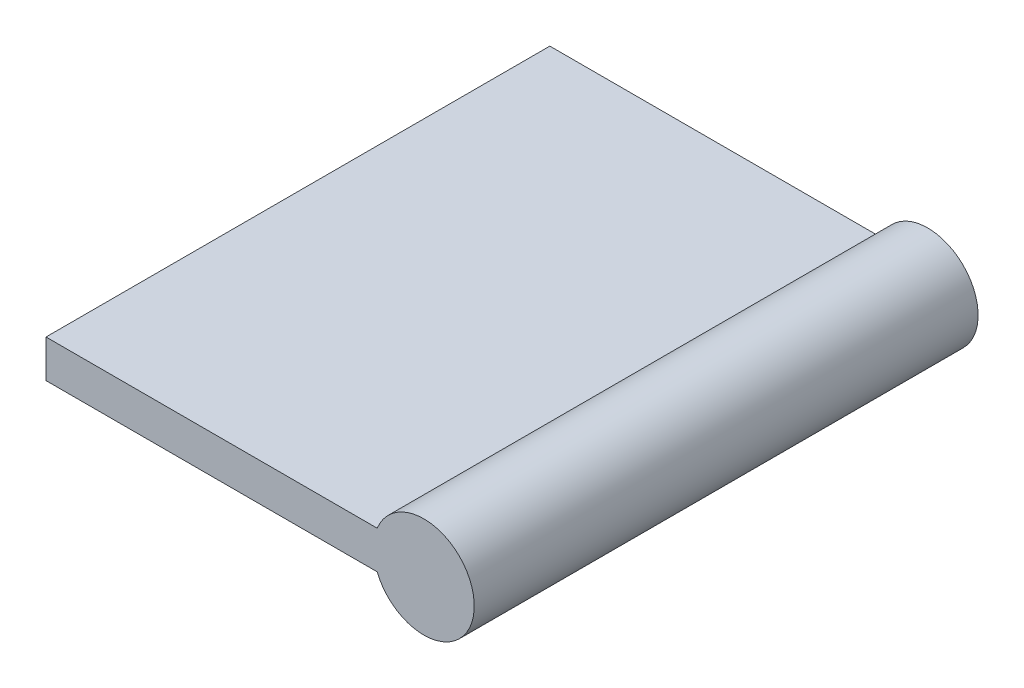
ISO-10303-21;
HEADER;
FILE_DESCRIPTION(('STEP AP214'),'2;1');
FILE_NAME('part.step','',(''),(''),'','','');
FILE_SCHEMA(('AUTOMOTIVE_DESIGN { 1 0 10303 214 1 1 1 1 }'));
ENDSEC;
DATA;
#1=APPLICATION_CONTEXT('core data for automotive mechanical design processes');
#2=APPLICATION_PROTOCOL_DEFINITION('international standard','automotive_design',2000,#1);
#3=PRODUCT_CONTEXT('',#1,'mechanical');
#4=PRODUCT('Part','Part','',(#3));
#5=PRODUCT_RELATED_PRODUCT_CATEGORY('part','',(#4));
#6=PRODUCT_DEFINITION_FORMATION('','',#4);
#7=PRODUCT_DEFINITION_CONTEXT('part definition',#1,'design');
#8=PRODUCT_DEFINITION('design','',#6,#7);
#9=PRODUCT_DEFINITION_SHAPE('','',#8);
#10=(LENGTH_UNIT() NAMED_UNIT(*) SI_UNIT(.MILLI.,.METRE.));
#11=(NAMED_UNIT(*) PLANE_ANGLE_UNIT() SI_UNIT($,.RADIAN.));
#12=(NAMED_UNIT(*) SI_UNIT($,.STERADIAN.) SOLID_ANGLE_UNIT());
#13=UNCERTAINTY_MEASURE_WITH_UNIT(LENGTH_MEASURE(1.E-05),#10,'distance_accuracy_value','');
#14=(GEOMETRIC_REPRESENTATION_CONTEXT(3) GLOBAL_UNCERTAINTY_ASSIGNED_CONTEXT((#13)) GLOBAL_UNIT_ASSIGNED_CONTEXT((#10,
#11,#12)) REPRESENTATION_CONTEXT('',''));
#15=CARTESIAN_POINT('',(0.,0.,0.));
#16=DIRECTION('',(0.,0.,1.));
#17=DIRECTION('',(1.,0.,0.));
#18=AXIS2_PLACEMENT_3D('',#15,#16,#17);
#19=CARTESIAN_POINT('',(0.,0.,10.));
#20=DIRECTION('',(0.,0.,-1.));
#21=DIRECTION('',(-1.,0.,0.));
#22=AXIS2_PLACEMENT_3D('',#19,#20,#21);
#23=CYLINDRICAL_SURFACE('',#22,2.);
#24=CARTESIAN_POINT('',(0.,0.,-10.));
#25=DIRECTION('',(0.,0.,1.));
#26=DIRECTION('',(1.,0.,0.));
#27=AXIS2_PLACEMENT_3D('',#24,#25,#26);
#28=CIRCLE('',#27,2.);
#29=CARTESIAN_POINT('',(-1.85404962177392,-0.75,-10.));
#30=VERTEX_POINT('',#29);
#31=CARTESIAN_POINT('',(-1.85404962177392,0.75,-10.));
#32=VERTEX_POINT('',#31);
#33=EDGE_CURVE('E36',#30,#32,#28,.T.);
#34=ORIENTED_EDGE('',*,*,#33,.T.);
#35=DIRECTION('',(0.,0.,-1.));
#36=VECTOR('',#35,1.);
#37=CARTESIAN_POINT('',(-1.85404962177392,0.75,10.));
#38=LINE('',#37,#36);
#39=CARTESIAN_POINT('',(-1.85404962177392,0.75,10.));
#40=VERTEX_POINT('',#39);
#41=EDGE_CURVE('E101',#32,#40,#38,.F.);
#42=ORIENTED_EDGE('',*,*,#41,.T.);
#43=CARTESIAN_POINT('',(0.,0.,10.));
#44=DIRECTION('',(0.,0.,1.));
#45=DIRECTION('',(1.,0.,0.));
#46=AXIS2_PLACEMENT_3D('',#43,#44,#45);
#47=CIRCLE('',#46,2.);
#48=CARTESIAN_POINT('',(-1.85404962177392,-0.75,10.));
#49=VERTEX_POINT('',#48);
#50=EDGE_CURVE('E11',#49,#40,#47,.T.);
#51=ORIENTED_EDGE('',*,*,#50,.F.);
#52=DIRECTION('',(0.,0.,-1.));
#53=VECTOR('',#52,1.);
#54=CARTESIAN_POINT('',(-1.85404962177392,-0.75,10.));
#55=LINE('',#54,#53);
#56=EDGE_CURVE('E75',#49,#30,#55,.T.);
#57=ORIENTED_EDGE('',*,*,#56,.T.);
#58=EDGE_LOOP('',(#34,#42,#51,#57));
#59=FACE_BOUND('',#58,.T.);
#60=ADVANCED_FACE('F33',(#59),#23,.T.);
#61=CARTESIAN_POINT('',(0.,0.,10.));
#62=DIRECTION('',(0.,0.,1.));
#63=DIRECTION('',(1.,0.,0.));
#64=AXIS2_PLACEMENT_3D('',#61,#62,#63);
#65=PLANE('',#64);
#66=ORIENTED_EDGE('',*,*,#50,.T.);
#67=DIRECTION('',(1.,0.,0.));
#68=VECTOR('',#67,1.);
#69=CARTESIAN_POINT('',(-15.,0.75,10.));
#70=LINE('',#69,#68);
#71=CARTESIAN_POINT('',(-15.,0.75,10.));
#72=VERTEX_POINT('',#71);
#73=EDGE_CURVE('E55',#72,#40,#70,.T.);
#74=ORIENTED_EDGE('',*,*,#73,.F.);
#75=DIRECTION('',(0.,-1.,0.));
#76=VECTOR('',#75,1.);
#77=CARTESIAN_POINT('',(-15.,0.75,10.));
#78=LINE('',#77,#76);
#79=CARTESIAN_POINT('',(-15.,-0.75,10.));
#80=VERTEX_POINT('',#79);
#81=EDGE_CURVE('E86',#72,#80,#78,.T.);
#82=ORIENTED_EDGE('',*,*,#81,.T.);
#83=DIRECTION('',(1.,0.,0.));
#84=VECTOR('',#83,1.);
#85=CARTESIAN_POINT('',(-15.,-0.75,10.));
#86=LINE('',#85,#84);
#87=EDGE_CURVE('E71',#80,#49,#86,.T.);
#88=ORIENTED_EDGE('',*,*,#87,.T.);
#89=EDGE_LOOP('',(#66,#74,#82,#88));
#90=FACE_BOUND('',#89,.T.);
#91=ADVANCED_FACE('F90',(#90),#65,.T.);
#92=CARTESIAN_POINT('',(0.,0.,-10.));
#93=DIRECTION('',(0.,0.,1.));
#94=DIRECTION('',(1.,0.,0.));
#95=AXIS2_PLACEMENT_3D('',#92,#93,#94);
#96=PLANE('',#95);
#97=ORIENTED_EDGE('',*,*,#33,.F.);
#98=DIRECTION('',(1.,0.,0.));
#99=VECTOR('',#98,1.);
#100=CARTESIAN_POINT('',(-15.,-0.75,-10.));
#101=LINE('',#100,#99);
#102=CARTESIAN_POINT('',(-15.,-0.75,-10.));
#103=VERTEX_POINT('',#102);
#104=EDGE_CURVE('E47',#103,#30,#101,.T.);
#105=ORIENTED_EDGE('',*,*,#104,.F.);
#106=DIRECTION('',(0.,1.,0.));
#107=VECTOR('',#106,1.);
#108=CARTESIAN_POINT('',(-15.,0.75,-10.));
#109=LINE('',#108,#107);
#110=CARTESIAN_POINT('',(-15.,0.75,-10.));
#111=VERTEX_POINT('',#110);
#112=EDGE_CURVE('E88',#103,#111,#109,.T.);
#113=ORIENTED_EDGE('',*,*,#112,.T.);
#114=DIRECTION('',(1.,0.,0.));
#115=VECTOR('',#114,1.);
#116=CARTESIAN_POINT('',(-15.,0.75,-10.));
#117=LINE('',#116,#115);
#118=EDGE_CURVE('E96',#111,#32,#117,.T.);
#119=ORIENTED_EDGE('',*,*,#118,.T.);
#120=EDGE_LOOP('',(#97,#105,#113,#119));
#121=FACE_BOUND('',#120,.T.);
#122=ADVANCED_FACE('F106',(#121),#96,.F.);
#123=CARTESIAN_POINT('',(-15.,0.75,-10.));
#124=DIRECTION('',(0.,1.,0.));
#125=DIRECTION('',(0.,0.,1.));
#126=AXIS2_PLACEMENT_3D('',#123,#124,#125);
#127=PLANE('',#126);
#128=ORIENTED_EDGE('',*,*,#41,.F.);
#129=ORIENTED_EDGE('',*,*,#118,.F.);
#130=DIRECTION('',(0.,0.,1.));
#131=VECTOR('',#130,1.);
#132=CARTESIAN_POINT('',(-15.,0.75,-10.));
#133=LINE('',#132,#131);
#134=EDGE_CURVE('E79',#111,#72,#133,.T.);
#135=ORIENTED_EDGE('',*,*,#134,.T.);
#136=ORIENTED_EDGE('',*,*,#73,.T.);
#137=EDGE_LOOP('',(#128,#129,#135,#136));
#138=FACE_BOUND('',#137,.T.);
#139=ADVANCED_FACE('F107',(#138),#127,.T.);
#140=CARTESIAN_POINT('',(-15.,-0.75,-10.));
#141=DIRECTION('',(0.,-1.,0.));
#142=DIRECTION('',(0.,0.,-1.));
#143=AXIS2_PLACEMENT_3D('',#140,#141,#142);
#144=PLANE('',#143);
#145=ORIENTED_EDGE('',*,*,#56,.F.);
#146=ORIENTED_EDGE('',*,*,#87,.F.);
#147=DIRECTION('',(0.,0.,-1.));
#148=VECTOR('',#147,1.);
#149=CARTESIAN_POINT('',(-15.,-0.75,-10.));
#150=LINE('',#149,#148);
#151=EDGE_CURVE('E74',#80,#103,#150,.T.);
#152=ORIENTED_EDGE('',*,*,#151,.T.);
#153=ORIENTED_EDGE('',*,*,#104,.T.);
#154=EDGE_LOOP('',(#145,#146,#152,#153));
#155=FACE_BOUND('',#154,.T.);
#156=ADVANCED_FACE('F73',(#155),#144,.T.);
#157=CARTESIAN_POINT('',(-15.,0.,0.));
#158=DIRECTION('',(-1.,0.,0.));
#159=DIRECTION('',(0.,0.,1.));
#160=AXIS2_PLACEMENT_3D('',#157,#158,#159);
#161=PLANE('',#160);
#162=ORIENTED_EDGE('',*,*,#81,.F.);
#163=ORIENTED_EDGE('',*,*,#134,.F.);
#164=ORIENTED_EDGE('',*,*,#112,.F.);
#165=ORIENTED_EDGE('',*,*,#151,.F.);
#166=EDGE_LOOP('',(#162,#163,#164,#165));
#167=FACE_BOUND('',#166,.T.);
#168=ADVANCED_FACE('F84',(#167),#161,.T.);
#169=CLOSED_SHELL('',(#60,#91,#122,#139,#156,#168));
#170=MANIFOLD_SOLID_BREP('B2',#169);
#171=ADVANCED_BREP_SHAPE_REPRESENTATION('',(#18,#170),#14);
#172=SHAPE_DEFINITION_REPRESENTATION(#9,#171);
ENDSEC;
END-ISO-10303-21;
